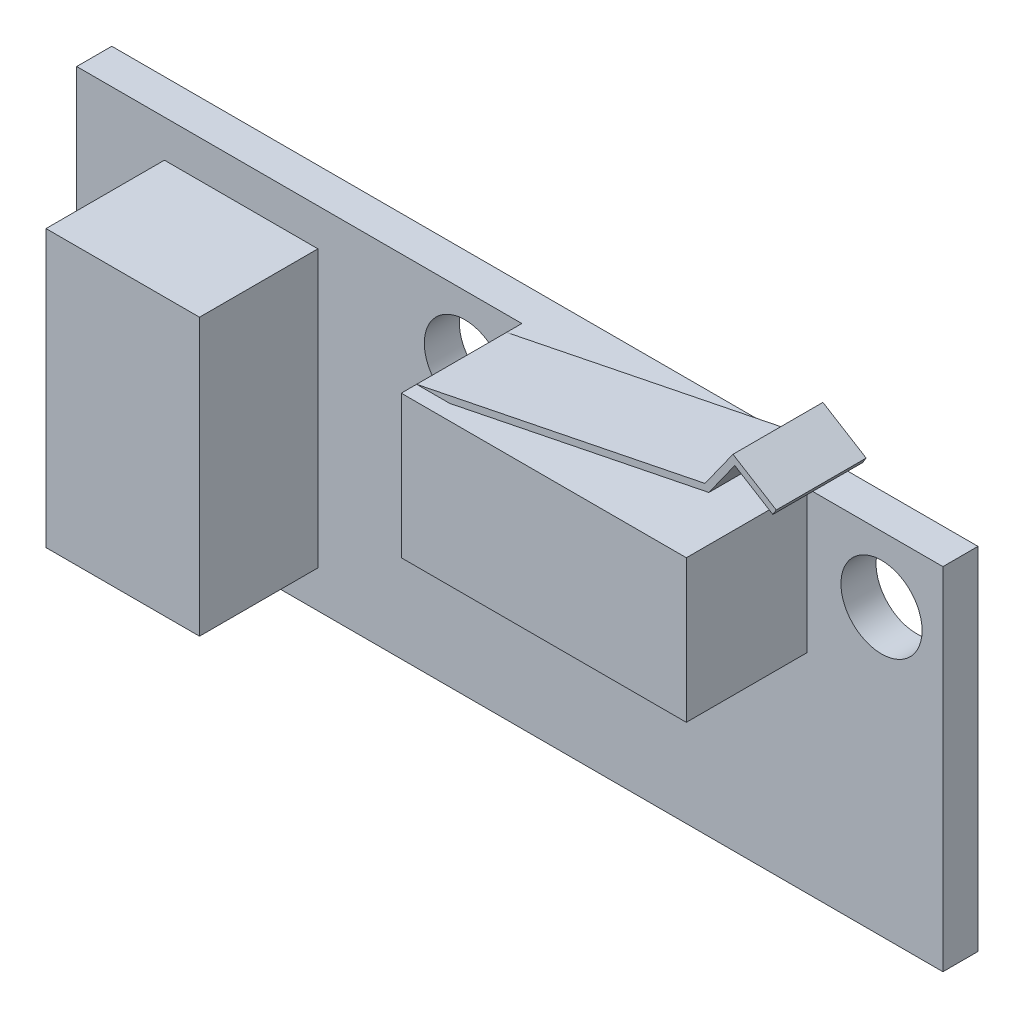
ISO-10303-21;
HEADER;
FILE_DESCRIPTION(('STEP AP214'),'2;1');
FILE_NAME('part.step','',(''),(''),'','','');
FILE_SCHEMA(('AUTOMOTIVE_DESIGN { 1 0 10303 214 1 1 1 1 }'));
ENDSEC;
DATA;
#1=APPLICATION_CONTEXT('core data for automotive mechanical design processes');
#2=APPLICATION_PROTOCOL_DEFINITION('international standard','automotive_design',2000,#1);
#3=PRODUCT_CONTEXT('',#1,'mechanical');
#4=PRODUCT('Part','Part','',(#3));
#5=PRODUCT_RELATED_PRODUCT_CATEGORY('part','',(#4));
#6=PRODUCT_DEFINITION_FORMATION('','',#4);
#7=PRODUCT_DEFINITION_CONTEXT('part definition',#1,'design');
#8=PRODUCT_DEFINITION('design','',#6,#7);
#9=PRODUCT_DEFINITION_SHAPE('','',#8);
#10=(LENGTH_UNIT() NAMED_UNIT(*) SI_UNIT(.MILLI.,.METRE.));
#11=(NAMED_UNIT(*) PLANE_ANGLE_UNIT() SI_UNIT($,.RADIAN.));
#12=(NAMED_UNIT(*) SI_UNIT($,.STERADIAN.) SOLID_ANGLE_UNIT());
#13=UNCERTAINTY_MEASURE_WITH_UNIT(LENGTH_MEASURE(1.E-05),#10,'distance_accuracy_value','');
#14=(GEOMETRIC_REPRESENTATION_CONTEXT(3) GLOBAL_UNCERTAINTY_ASSIGNED_CONTEXT((#13)) GLOBAL_UNIT_ASSIGNED_CONTEXT((#10,
#11,#12)) REPRESENTATION_CONTEXT('',''));
#15=CARTESIAN_POINT('',(0.,0.,0.));
#16=DIRECTION('',(0.,0.,1.));
#17=DIRECTION('',(1.,0.,0.));
#18=AXIS2_PLACEMENT_3D('',#15,#16,#17);
#19=CARTESIAN_POINT('',(0.,0.,1.6));
#20=DIRECTION('',(0.,0.,-1.));
#21=DIRECTION('',(-1.,0.,0.));
#22=AXIS2_PLACEMENT_3D('',#19,#20,#21);
#23=PLANE('',#22);
#24=DIRECTION('',(0.,-1.,0.));
#25=VECTOR('',#24,1.);
#26=CARTESIAN_POINT('',(0.55,8.,1.6));
#27=LINE('',#26,#25);
#28=CARTESIAN_POINT('',(0.55,8.,1.6));
#29=VERTEX_POINT('',#28);
#30=CARTESIAN_POINT('',(0.550000000000001,1.5,1.6));
#31=VERTEX_POINT('',#30);
#32=EDGE_CURVE('E261',#29,#31,#27,.T.);
#33=ORIENTED_EDGE('',*,*,#32,.F.);
#34=DIRECTION('',(-1.,0.,0.));
#35=VECTOR('',#34,1.);
#36=CARTESIAN_POINT('',(-19.75,8.,1.6));
#37=LINE('',#36,#35);
#38=CARTESIAN_POINT('',(-19.75,8.,1.6));
#39=VERTEX_POINT('',#38);
#40=EDGE_CURVE('E307',#29,#39,#37,.T.);
#41=ORIENTED_EDGE('',*,*,#40,.T.);
#42=DIRECTION('',(0.,-1.,0.));
#43=VECTOR('',#42,1.);
#44=CARTESIAN_POINT('',(-19.75,-8.,1.6));
#45=LINE('',#44,#43);
#46=CARTESIAN_POINT('',(-19.75,-8.,1.6));
#47=VERTEX_POINT('',#46);
#48=EDGE_CURVE('E312',#39,#47,#45,.T.);
#49=ORIENTED_EDGE('',*,*,#48,.T.);
#50=DIRECTION('',(1.,0.,0.));
#51=VECTOR('',#50,1.);
#52=CARTESIAN_POINT('',(-19.75,-8.,1.6));
#53=LINE('',#52,#51);
#54=CARTESIAN_POINT('',(19.75,-8.,1.6));
#55=VERTEX_POINT('',#54);
#56=EDGE_CURVE('E314',#47,#55,#53,.T.);
#57=ORIENTED_EDGE('',*,*,#56,.T.);
#58=DIRECTION('',(0.,1.,0.));
#59=VECTOR('',#58,1.);
#60=CARTESIAN_POINT('',(19.75,-8.,1.6));
#61=LINE('',#60,#59);
#62=CARTESIAN_POINT('',(19.75,8.,1.6));
#63=VERTEX_POINT('',#62);
#64=EDGE_CURVE('E304',#55,#63,#61,.T.);
#65=ORIENTED_EDGE('',*,*,#64,.T.);
#66=CARTESIAN_POINT('',(13.55,8.,1.6));
#67=VERTEX_POINT('',#66);
#68=EDGE_CURVE('E309',#63,#67,#37,.T.);
#69=ORIENTED_EDGE('',*,*,#68,.T.);
#70=DIRECTION('',(0.,1.,0.));
#71=VECTOR('',#70,1.);
#72=CARTESIAN_POINT('',(13.55,8.,1.6));
#73=LINE('',#72,#71);
#74=CARTESIAN_POINT('',(13.55,1.5,1.6));
#75=VERTEX_POINT('',#74);
#76=EDGE_CURVE('E266',#75,#67,#73,.T.);
#77=ORIENTED_EDGE('',*,*,#76,.F.);
#78=DIRECTION('',(1.,0.,0.));
#79=VECTOR('',#78,1.);
#80=CARTESIAN_POINT('',(0.550000000000001,1.5,1.6));
#81=LINE('',#80,#79);
#82=EDGE_CURVE('E275',#31,#75,#81,.T.);
#83=ORIENTED_EDGE('',*,*,#82,.F.);
#84=EDGE_LOOP('',(#33,#41,#49,#57,#65,#69,#77,#83));
#85=FACE_BOUND('',#84,.T.);
#86=CARTESIAN_POINT('',(16.95,5.,1.6));
#87=DIRECTION('',(0.,0.,1.));
#88=DIRECTION('',(1.,0.,0.));
#89=AXIS2_PLACEMENT_3D('',#86,#87,#88);
#90=CIRCLE('',#89,1.85);
#91=CARTESIAN_POINT('',(18.8,5.,1.6));
#92=VERTEX_POINT('',#91);
#93=EDGE_CURVE('E296',#92,#92,#90,.T.);
#94=ORIENTED_EDGE('',*,*,#93,.F.);
#95=EDGE_LOOP('',(#94));
#96=FACE_BOUND('',#95,.T.);
#97=CARTESIAN_POINT('',(-2.05,5.,1.6));
#98=DIRECTION('',(0.,0.,1.));
#99=DIRECTION('',(1.,0.,0.));
#100=AXIS2_PLACEMENT_3D('',#97,#98,#99);
#101=CIRCLE('',#100,1.85);
#102=CARTESIAN_POINT('',(-0.2,5.,1.6));
#103=VERTEX_POINT('',#102);
#104=EDGE_CURVE('E291',#103,#103,#101,.T.);
#105=ORIENTED_EDGE('',*,*,#104,.F.);
#106=EDGE_LOOP('',(#105));
#107=FACE_BOUND('',#106,.T.);
#108=DIRECTION('',(0.,1.,0.));
#109=VECTOR('',#108,1.);
#110=CARTESIAN_POINT('',(-8.75,-6.3,1.6));
#111=LINE('',#110,#109);
#112=CARTESIAN_POINT('',(-8.75,-6.3,1.6));
#113=VERTEX_POINT('',#112);
#114=CARTESIAN_POINT('',(-8.75,6.3,1.6));
#115=VERTEX_POINT('',#114);
#116=EDGE_CURVE('E190',#113,#115,#111,.T.);
#117=ORIENTED_EDGE('',*,*,#116,.F.);
#118=DIRECTION('',(1.,0.,0.));
#119=VECTOR('',#118,1.);
#120=CARTESIAN_POINT('',(-15.75,-6.3,1.6));
#121=LINE('',#120,#119);
#122=CARTESIAN_POINT('',(-15.75,-6.3,1.6));
#123=VERTEX_POINT('',#122);
#124=EDGE_CURVE('E187',#123,#113,#121,.T.);
#125=ORIENTED_EDGE('',*,*,#124,.F.);
#126=DIRECTION('',(0.,-1.,0.));
#127=VECTOR('',#126,1.);
#128=CARTESIAN_POINT('',(-15.75,-6.3,1.6));
#129=LINE('',#128,#127);
#130=CARTESIAN_POINT('',(-15.75,6.3,1.6));
#131=VERTEX_POINT('',#130);
#132=EDGE_CURVE('E53',#131,#123,#129,.T.);
#133=ORIENTED_EDGE('',*,*,#132,.F.);
#134=DIRECTION('',(-1.,0.,0.));
#135=VECTOR('',#134,1.);
#136=CARTESIAN_POINT('',(-15.75,6.3,1.6));
#137=LINE('',#136,#135);
#138=EDGE_CURVE('E48',#115,#131,#137,.T.);
#139=ORIENTED_EDGE('',*,*,#138,.F.);
#140=EDGE_LOOP('',(#117,#125,#133,#139));
#141=FACE_BOUND('',#140,.T.);
#142=ADVANCED_FACE('F33',(#85,#96,#107,#141),#23,.F.);
#143=CARTESIAN_POINT('',(13.8759660549111,10.3906288236853,-15.3930132701649));
#144=DIRECTION('',(0.198344544636717,-0.980132359231575,0.));
#145=DIRECTION('',(0.980132359231575,0.198344544636717,0.));
#146=AXIS2_PLACEMENT_3D('',#143,#144,#145);
#147=PLANE('',#146);
#148=DIRECTION('',(0.,0.,1.));
#149=VECTOR('',#148,1.);
#150=CARTESIAN_POINT('',(13.8759660549111,10.3906288236853,-15.3930132701649));
#151=LINE('',#150,#149);
#152=CARTESIAN_POINT('',(13.8759660549111,10.3906288236853,2.3));
#153=VERTEX_POINT('',#152);
#154=CARTESIAN_POINT('',(13.8759660549111,10.3906288236853,6.4));
#155=VERTEX_POINT('',#154);
#156=EDGE_CURVE('E240',#153,#155,#151,.T.);
#157=ORIENTED_EDGE('',*,*,#156,.T.);
#158=DIRECTION('',(-0.980132359231575,-0.198344544636717,0.));
#159=VECTOR('',#158,1.);
#160=CARTESIAN_POINT('',(13.8759660549111,10.3906288236853,6.4));
#161=LINE('',#160,#159);
#162=CARTESIAN_POINT('',(2.06251954294721,8.,6.4));
#163=VERTEX_POINT('',#162);
#164=EDGE_CURVE('E237',#155,#163,#161,.T.);
#165=ORIENTED_EDGE('',*,*,#164,.T.);
#166=DIRECTION('',(0.,0.,1.));
#167=VECTOR('',#166,1.);
#168=CARTESIAN_POINT('',(2.06251954294721,8.,-15.3930132701649));
#169=LINE('',#168,#167);
#170=CARTESIAN_POINT('',(2.06251954294721,8.,2.3));
#171=VERTEX_POINT('',#170);
#172=EDGE_CURVE('E244',#171,#163,#169,.T.);
#173=ORIENTED_EDGE('',*,*,#172,.F.);
#174=DIRECTION('',(0.980132359231575,0.198344544636717,0.));
#175=VECTOR('',#174,1.);
#176=CARTESIAN_POINT('',(13.8759660549111,10.3906288236853,2.3));
#177=LINE('',#176,#175);
#178=EDGE_CURVE('E219',#171,#153,#177,.T.);
#179=ORIENTED_EDGE('',*,*,#178,.T.);
#180=EDGE_LOOP('',(#157,#165,#173,#179));
#181=FACE_BOUND('',#180,.T.);
#182=ADVANCED_FACE('F371',(#181),#147,.T.);
#183=CARTESIAN_POINT('',(15.0587785145612,12.0476863131206,-15.3930132701649));
#184=DIRECTION('',(0.813919290439679,-0.580977958833354,0.));
#185=DIRECTION('',(0.580977958833354,0.813919290439679,0.));
#186=AXIS2_PLACEMENT_3D('',#183,#184,#185);
#187=PLANE('',#186);
#188=DIRECTION('',(0.,0.,1.));
#189=VECTOR('',#188,1.);
#190=CARTESIAN_POINT('',(15.0587785145612,12.0476863131206,-15.3930132701649));
#191=LINE('',#190,#189);
#192=CARTESIAN_POINT('',(15.0587785145612,12.0476863131206,2.3));
#193=VERTEX_POINT('',#192);
#194=CARTESIAN_POINT('',(15.0587785145612,12.0476863131206,6.4));
#195=VERTEX_POINT('',#194);
#196=EDGE_CURVE('E254',#193,#195,#191,.T.);
#197=ORIENTED_EDGE('',*,*,#196,.T.);
#198=DIRECTION('',(-0.580977958833354,-0.813919290439679,0.));
#199=VECTOR('',#198,1.);
#200=CARTESIAN_POINT('',(15.0587785145612,12.0476863131206,6.4));
#201=LINE('',#200,#199);
#202=EDGE_CURVE('E234',#195,#155,#201,.T.);
#203=ORIENTED_EDGE('',*,*,#202,.T.);
#204=ORIENTED_EDGE('',*,*,#156,.F.);
#205=DIRECTION('',(0.580977958833354,0.813919290439679,0.));
#206=VECTOR('',#205,1.);
#207=CARTESIAN_POINT('',(15.0587785145612,12.0476863131206,2.3));
#208=LINE('',#207,#206);
#209=EDGE_CURVE('E216',#153,#193,#208,.T.);
#210=ORIENTED_EDGE('',*,*,#209,.T.);
#211=EDGE_LOOP('',(#197,#203,#204,#210));
#212=FACE_BOUND('',#211,.T.);
#213=ADVANCED_FACE('F368',(#212),#187,.T.);
#214=CARTESIAN_POINT('',(16.7928028673529,10.980894683081,-15.3930132701649));
#215=DIRECTION('',(-0.523990442157015,-0.851724143445573,0.));
#216=DIRECTION('',(0.851724143445573,-0.523990442157016,0.));
#217=AXIS2_PLACEMENT_3D('',#214,#215,#216);
#218=PLANE('',#217);
#219=DIRECTION('',(0.,0.,1.));
#220=VECTOR('',#219,1.);
#221=CARTESIAN_POINT('',(16.7928028673529,10.980894683081,-15.3930132701649));
#222=LINE('',#221,#220);
#223=CARTESIAN_POINT('',(16.7928028673529,10.980894683081,2.3));
#224=VERTEX_POINT('',#223);
#225=CARTESIAN_POINT('',(16.7928028673529,10.980894683081,6.4));
#226=VERTEX_POINT('',#225);
#227=EDGE_CURVE('E251',#224,#226,#222,.T.);
#228=ORIENTED_EDGE('',*,*,#227,.T.);
#229=DIRECTION('',(-0.851724143445573,0.523990442157016,0.));
#230=VECTOR('',#229,1.);
#231=CARTESIAN_POINT('',(16.7928028673529,10.980894683081,6.4));
#232=LINE('',#231,#230);
#233=EDGE_CURVE('E231',#226,#195,#232,.T.);
#234=ORIENTED_EDGE('',*,*,#233,.T.);
#235=ORIENTED_EDGE('',*,*,#196,.F.);
#236=DIRECTION('',(0.851724143445573,-0.523990442157016,0.));
#237=VECTOR('',#236,1.);
#238=CARTESIAN_POINT('',(16.7928028673529,10.980894683081,2.3));
#239=LINE('',#238,#237);
#240=EDGE_CURVE('E213',#193,#224,#239,.T.);
#241=ORIENTED_EDGE('',*,*,#240,.T.);
#242=EDGE_LOOP('',(#228,#234,#235,#241));
#243=FACE_BOUND('',#242,.T.);
#244=ADVANCED_FACE('F366',(#243),#218,.T.);
#245=CARTESIAN_POINT('',(16.95,11.2364119261147,-15.3930132701649));
#246=DIRECTION('',(0.851724143445577,-0.523990442157009,0.));
#247=DIRECTION('',(0.523990442157009,0.851724143445577,0.));
#248=AXIS2_PLACEMENT_3D('',#245,#246,#247);
#249=PLANE('',#248);
#250=DIRECTION('',(0.,0.,1.));
#251=VECTOR('',#250,1.);
#252=CARTESIAN_POINT('',(16.95,11.2364119261147,-15.3930132701649));
#253=LINE('',#252,#251);
#254=CARTESIAN_POINT('',(16.95,11.2364119261147,2.3));
#255=VERTEX_POINT('',#254);
#256=CARTESIAN_POINT('',(16.95,11.2364119261147,6.4));
#257=VERTEX_POINT('',#256);
#258=EDGE_CURVE('E248',#255,#257,#253,.T.);
#259=ORIENTED_EDGE('',*,*,#258,.T.);
#260=DIRECTION('',(-0.523990442157009,-0.851724143445577,0.));
#261=VECTOR('',#260,1.);
#262=CARTESIAN_POINT('',(16.95,11.2364119261147,6.4));
#263=LINE('',#262,#261);
#264=EDGE_CURVE('E228',#257,#226,#263,.T.);
#265=ORIENTED_EDGE('',*,*,#264,.T.);
#266=ORIENTED_EDGE('',*,*,#227,.F.);
#267=DIRECTION('',(0.523990442157009,0.851724143445577,0.));
#268=VECTOR('',#267,1.);
#269=CARTESIAN_POINT('',(16.95,11.2364119261147,2.3));
#270=LINE('',#269,#268);
#271=EDGE_CURVE('E210',#224,#255,#270,.T.);
#272=ORIENTED_EDGE('',*,*,#271,.T.);
#273=EDGE_LOOP('',(#259,#265,#266,#272));
#274=FACE_BOUND('',#273,.T.);
#275=ADVANCED_FACE('F362',(#274),#249,.T.);
#276=CARTESIAN_POINT('',(14.9773642807859,12.45,-15.3930132701649));
#277=DIRECTION('',(0.523990442157015,0.851724143445573,0.));
#278=DIRECTION('',(-0.851724143445574,0.523990442157015,0.));
#279=AXIS2_PLACEMENT_3D('',#276,#277,#278);
#280=PLANE('',#279);
#281=DIRECTION('',(0.,0.,1.));
#282=VECTOR('',#281,1.);
#283=CARTESIAN_POINT('',(14.9773642807859,12.45,-15.3930132701649));
#284=LINE('',#283,#282);
#285=CARTESIAN_POINT('',(14.9773642807859,12.45,2.3));
#286=VERTEX_POINT('',#285);
#287=CARTESIAN_POINT('',(14.9773642807859,12.45,6.4));
#288=VERTEX_POINT('',#287);
#289=EDGE_CURVE('E245',#286,#288,#284,.T.);
#290=ORIENTED_EDGE('',*,*,#289,.T.);
#291=DIRECTION('',(0.851724143445574,-0.523990442157015,0.));
#292=VECTOR('',#291,1.);
#293=CARTESIAN_POINT('',(14.9773642807859,12.45,6.4));
#294=LINE('',#293,#292);
#295=EDGE_CURVE('E225',#288,#257,#294,.T.);
#296=ORIENTED_EDGE('',*,*,#295,.T.);
#297=ORIENTED_EDGE('',*,*,#258,.F.);
#298=DIRECTION('',(-0.851724143445574,0.523990442157015,0.));
#299=VECTOR('',#298,1.);
#300=CARTESIAN_POINT('',(14.9773642807859,12.45,2.3));
#301=LINE('',#300,#299);
#302=EDGE_CURVE('E207',#255,#286,#301,.T.);
#303=ORIENTED_EDGE('',*,*,#302,.T.);
#304=EDGE_LOOP('',(#290,#296,#297,#303));
#305=FACE_BOUND('',#304,.T.);
#306=ADVANCED_FACE('F360',(#305),#280,.T.);
#307=CARTESIAN_POINT('',(13.7005173824207,10.6612052519095,-15.3930132701649));
#308=DIRECTION('',(-0.813919290439679,0.580977958833353,0.));
#309=DIRECTION('',(-0.580977958833353,-0.813919290439679,0.));
#310=AXIS2_PLACEMENT_3D('',#307,#308,#309);
#311=PLANE('',#310);
#312=DIRECTION('',(0.,0.,1.));
#313=VECTOR('',#312,1.);
#314=CARTESIAN_POINT('',(13.7005173824207,10.6612052519095,-15.3930132701649));
#315=LINE('',#314,#313);
#316=CARTESIAN_POINT('',(13.7005173824207,10.6612052519095,2.3));
#317=VERTEX_POINT('',#316);
#318=CARTESIAN_POINT('',(13.7005173824207,10.6612052519095,6.4));
#319=VERTEX_POINT('',#318);
#320=EDGE_CURVE('E241',#317,#319,#315,.T.);
#321=ORIENTED_EDGE('',*,*,#320,.T.);
#322=DIRECTION('',(0.580977958833353,0.813919290439679,0.));
#323=VECTOR('',#322,1.);
#324=CARTESIAN_POINT('',(13.7005173824207,10.6612052519095,6.4));
#325=LINE('',#324,#323);
#326=EDGE_CURVE('E222',#319,#288,#325,.T.);
#327=ORIENTED_EDGE('',*,*,#326,.T.);
#328=ORIENTED_EDGE('',*,*,#289,.F.);
#329=DIRECTION('',(-0.580977958833353,-0.813919290439679,0.));
#330=VECTOR('',#329,1.);
#331=CARTESIAN_POINT('',(13.7005173824207,10.6612052519095,2.3));
#332=LINE('',#331,#330);
#333=EDGE_CURVE('E201',#286,#317,#332,.T.);
#334=ORIENTED_EDGE('',*,*,#333,.T.);
#335=EDGE_LOOP('',(#321,#327,#328,#334));
#336=FACE_BOUND('',#335,.T.);
#337=ADVANCED_FACE('F355',(#336),#311,.T.);
#338=CARTESIAN_POINT('',(0.55,8.,-15.3930132701649));
#339=DIRECTION('',(-0.198344544636717,0.980132359231575,0.));
#340=DIRECTION('',(-0.980132359231575,-0.198344544636717,0.));
#341=AXIS2_PLACEMENT_3D('',#338,#339,#340);
#342=PLANE('',#341);
#343=DIRECTION('',(0.,0.,-1.));
#344=VECTOR('',#343,1.);
#345=CARTESIAN_POINT('',(0.55,8.,7.1));
#346=LINE('',#345,#344);
#347=CARTESIAN_POINT('',(0.55,8.,6.4));
#348=VERTEX_POINT('',#347);
#349=CARTESIAN_POINT('',(0.55,8.,2.3));
#350=VERTEX_POINT('',#349);
#351=EDGE_CURVE('E272',#348,#350,#346,.T.);
#352=ORIENTED_EDGE('',*,*,#351,.F.);
#353=DIRECTION('',(0.980132359231575,0.198344544636717,0.));
#354=VECTOR('',#353,1.);
#355=CARTESIAN_POINT('',(0.55,8.,6.4));
#356=LINE('',#355,#354);
#357=EDGE_CURVE('E11',#348,#319,#356,.T.);
#358=ORIENTED_EDGE('',*,*,#357,.T.);
#359=ORIENTED_EDGE('',*,*,#320,.F.);
#360=DIRECTION('',(-0.980132359231575,-0.198344544636717,0.));
#361=VECTOR('',#360,1.);
#362=CARTESIAN_POINT('',(0.55,8.,2.3));
#363=LINE('',#362,#361);
#364=EDGE_CURVE('E41',#317,#350,#363,.T.);
#365=ORIENTED_EDGE('',*,*,#364,.T.);
#366=EDGE_LOOP('',(#352,#358,#359,#365));
#367=FACE_BOUND('',#366,.T.);
#368=ADVANCED_FACE('F339',(#367),#342,.T.);
#369=CARTESIAN_POINT('',(19.75,-8.,1.6));
#370=DIRECTION('',(-1.,0.,0.));
#371=DIRECTION('',(0.,0.,1.));
#372=AXIS2_PLACEMENT_3D('',#369,#370,#371);
#373=PLANE('',#372);
#374=DIRECTION('',(0.,1.,0.));
#375=VECTOR('',#374,1.);
#376=CARTESIAN_POINT('',(19.75,-8.,0.));
#377=LINE('',#376,#375);
#378=CARTESIAN_POINT('',(19.75,-8.,0.));
#379=VERTEX_POINT('',#378);
#380=CARTESIAN_POINT('',(19.75,8.,0.));
#381=VERTEX_POINT('',#380);
#382=EDGE_CURVE('E295',#379,#381,#377,.T.);
#383=ORIENTED_EDGE('',*,*,#382,.T.);
#384=DIRECTION('',(0.,0.,-1.));
#385=VECTOR('',#384,1.);
#386=CARTESIAN_POINT('',(19.75,8.,1.6));
#387=LINE('',#386,#385);
#388=EDGE_CURVE('E332',#63,#381,#387,.T.);
#389=ORIENTED_EDGE('',*,*,#388,.F.);
#390=ORIENTED_EDGE('',*,*,#64,.F.);
#391=DIRECTION('',(0.,0.,-1.));
#392=VECTOR('',#391,1.);
#393=CARTESIAN_POINT('',(19.75,-8.,1.6));
#394=LINE('',#393,#392);
#395=EDGE_CURVE('E316',#55,#379,#394,.T.);
#396=ORIENTED_EDGE('',*,*,#395,.T.);
#397=EDGE_LOOP('',(#383,#389,#390,#396));
#398=FACE_BOUND('',#397,.T.);
#399=ADVANCED_FACE('F35',(#398),#373,.F.);
#400=CARTESIAN_POINT('',(-19.75,8.,1.6));
#401=DIRECTION('',(0.,-1.,0.));
#402=DIRECTION('',(0.,0.,-1.));
#403=AXIS2_PLACEMENT_3D('',#400,#401,#402);
#404=PLANE('',#403);
#405=DIRECTION('',(0.,0.,-1.));
#406=VECTOR('',#405,1.);
#407=CARTESIAN_POINT('',(13.55,8.,7.1));
#408=LINE('',#407,#406);
#409=CARTESIAN_POINT('',(13.55,8.,7.1));
#410=VERTEX_POINT('',#409);
#411=EDGE_CURVE('E283',#410,#67,#408,.T.);
#412=ORIENTED_EDGE('',*,*,#411,.T.);
#413=ORIENTED_EDGE('',*,*,#68,.F.);
#414=ORIENTED_EDGE('',*,*,#388,.T.);
#415=DIRECTION('',(-1.,0.,0.));
#416=VECTOR('',#415,1.);
#417=CARTESIAN_POINT('',(-19.75,8.,0.));
#418=LINE('',#417,#416);
#419=CARTESIAN_POINT('',(-19.75,8.,0.));
#420=VERTEX_POINT('',#419);
#421=EDGE_CURVE('E319',#381,#420,#418,.T.);
#422=ORIENTED_EDGE('',*,*,#421,.T.);
#423=DIRECTION('',(0.,0.,-1.));
#424=VECTOR('',#423,1.);
#425=CARTESIAN_POINT('',(-19.75,8.,1.6));
#426=LINE('',#425,#424);
#427=EDGE_CURVE('E329',#39,#420,#426,.T.);
#428=ORIENTED_EDGE('',*,*,#427,.F.);
#429=ORIENTED_EDGE('',*,*,#40,.F.);
#430=DIRECTION('',(0.,0.,1.));
#431=VECTOR('',#430,1.);
#432=CARTESIAN_POINT('',(0.55,8.,1.6));
#433=LINE('',#432,#431);
#434=EDGE_CURVE('E191',#29,#350,#433,.T.);
#435=ORIENTED_EDGE('',*,*,#434,.T.);
#436=DIRECTION('',(1.,0.,0.));
#437=VECTOR('',#436,1.);
#438=CARTESIAN_POINT('',(0.55,8.,2.3));
#439=LINE('',#438,#437);
#440=EDGE_CURVE('E194',#350,#171,#439,.T.);
#441=ORIENTED_EDGE('',*,*,#440,.T.);
#442=ORIENTED_EDGE('',*,*,#172,.T.);
#443=DIRECTION('',(-1.,0.,0.));
#444=VECTOR('',#443,1.);
#445=CARTESIAN_POINT('',(0.55,8.,6.4));
#446=LINE('',#445,#444);
#447=EDGE_CURVE('E200',#163,#348,#446,.T.);
#448=ORIENTED_EDGE('',*,*,#447,.T.);
#449=CARTESIAN_POINT('',(0.55,8.,7.1));
#450=VERTEX_POINT('',#449);
#451=EDGE_CURVE('E280',#450,#348,#346,.T.);
#452=ORIENTED_EDGE('',*,*,#451,.F.);
#453=DIRECTION('',(-1.,0.,0.));
#454=VECTOR('',#453,1.);
#455=CARTESIAN_POINT('',(0.55,8.,7.1));
#456=LINE('',#455,#454);
#457=EDGE_CURVE('E270',#410,#450,#456,.T.);
#458=ORIENTED_EDGE('',*,*,#457,.F.);
#459=EDGE_LOOP('',(#412,#413,#414,#422,#428,#429,#435,#441,#442,#448,#452,#458));
#460=FACE_BOUND('',#459,.T.);
#461=ADVANCED_FACE('F349',(#460),#404,.F.);
#462=CARTESIAN_POINT('',(-19.75,-8.,1.6));
#463=DIRECTION('',(1.,0.,0.));
#464=DIRECTION('',(0.,0.,-1.));
#465=AXIS2_PLACEMENT_3D('',#462,#463,#464);
#466=PLANE('',#465);
#467=DIRECTION('',(0.,-1.,0.));
#468=VECTOR('',#467,1.);
#469=CARTESIAN_POINT('',(-19.75,-8.,0.));
#470=LINE('',#469,#468);
#471=CARTESIAN_POINT('',(-19.75,-8.,0.));
#472=VERTEX_POINT('',#471);
#473=EDGE_CURVE('E321',#420,#472,#470,.T.);
#474=ORIENTED_EDGE('',*,*,#473,.T.);
#475=DIRECTION('',(0.,0.,-1.));
#476=VECTOR('',#475,1.);
#477=CARTESIAN_POINT('',(-19.75,-8.,1.6));
#478=LINE('',#477,#476);
#479=EDGE_CURVE('E326',#47,#472,#478,.T.);
#480=ORIENTED_EDGE('',*,*,#479,.F.);
#481=ORIENTED_EDGE('',*,*,#48,.F.);
#482=ORIENTED_EDGE('',*,*,#427,.T.);
#483=EDGE_LOOP('',(#474,#480,#481,#482));
#484=FACE_BOUND('',#483,.T.);
#485=ADVANCED_FACE('F413',(#484),#466,.F.);
#486=CARTESIAN_POINT('',(-19.75,-8.,1.6));
#487=DIRECTION('',(0.,1.,0.));
#488=DIRECTION('',(0.,0.,1.));
#489=AXIS2_PLACEMENT_3D('',#486,#487,#488);
#490=PLANE('',#489);
#491=DIRECTION('',(1.,0.,0.));
#492=VECTOR('',#491,1.);
#493=CARTESIAN_POINT('',(-19.75,-8.,0.));
#494=LINE('',#493,#492);
#495=EDGE_CURVE('E308',#472,#379,#494,.T.);
#496=ORIENTED_EDGE('',*,*,#495,.T.);
#497=ORIENTED_EDGE('',*,*,#395,.F.);
#498=ORIENTED_EDGE('',*,*,#56,.F.);
#499=ORIENTED_EDGE('',*,*,#479,.T.);
#500=EDGE_LOOP('',(#496,#497,#498,#499));
#501=FACE_BOUND('',#500,.T.);
#502=ADVANCED_FACE('F409',(#501),#490,.F.);
#503=CARTESIAN_POINT('',(0.,0.,0.));
#504=DIRECTION('',(0.,0.,-1.));
#505=DIRECTION('',(-1.,0.,0.));
#506=AXIS2_PLACEMENT_3D('',#503,#504,#505);
#507=PLANE('',#506);
#508=CARTESIAN_POINT('',(16.95,5.,0.));
#509=DIRECTION('',(0.,0.,1.));
#510=DIRECTION('',(1.,0.,0.));
#511=AXIS2_PLACEMENT_3D('',#508,#509,#510);
#512=CIRCLE('',#511,1.85);
#513=CARTESIAN_POINT('',(18.8,5.,0.));
#514=VERTEX_POINT('',#513);
#515=EDGE_CURVE('E292',#514,#514,#512,.T.);
#516=ORIENTED_EDGE('',*,*,#515,.T.);
#517=EDGE_LOOP('',(#516));
#518=FACE_BOUND('',#517,.T.);
#519=CARTESIAN_POINT('',(-2.05,5.,0.));
#520=DIRECTION('',(0.,0.,1.));
#521=DIRECTION('',(1.,0.,0.));
#522=AXIS2_PLACEMENT_3D('',#519,#520,#521);
#523=CIRCLE('',#522,1.85);
#524=CARTESIAN_POINT('',(-0.2,5.,0.));
#525=VERTEX_POINT('',#524);
#526=EDGE_CURVE('E299',#525,#525,#523,.T.);
#527=ORIENTED_EDGE('',*,*,#526,.T.);
#528=EDGE_LOOP('',(#527));
#529=FACE_BOUND('',#528,.T.);
#530=ORIENTED_EDGE('',*,*,#382,.F.);
#531=ORIENTED_EDGE('',*,*,#495,.F.);
#532=ORIENTED_EDGE('',*,*,#473,.F.);
#533=ORIENTED_EDGE('',*,*,#421,.F.);
#534=EDGE_LOOP('',(#530,#531,#532,#533));
#535=FACE_BOUND('',#534,.T.);
#536=ADVANCED_FACE('F404',(#518,#529,#535),#507,.T.);
#537=CARTESIAN_POINT('',(-2.05,5.,0.));
#538=DIRECTION('',(0.,0.,1.));
#539=DIRECTION('',(1.,0.,0.));
#540=AXIS2_PLACEMENT_3D('',#537,#538,#539);
#541=CYLINDRICAL_SURFACE('',#540,1.85);
#542=ORIENTED_EDGE('',*,*,#526,.F.);
#543=EDGE_LOOP('',(#542));
#544=FACE_BOUND('',#543,.T.);
#545=ORIENTED_EDGE('',*,*,#104,.T.);
#546=EDGE_LOOP('',(#545));
#547=FACE_BOUND('',#546,.T.);
#548=ADVANCED_FACE('F401',(#544,#547),#541,.F.);
#549=CARTESIAN_POINT('',(16.95,5.,0.));
#550=DIRECTION('',(0.,0.,1.));
#551=DIRECTION('',(1.,0.,0.));
#552=AXIS2_PLACEMENT_3D('',#549,#550,#551);
#553=CYLINDRICAL_SURFACE('',#552,1.85);
#554=ORIENTED_EDGE('',*,*,#515,.F.);
#555=EDGE_LOOP('',(#554));
#556=FACE_BOUND('',#555,.T.);
#557=ORIENTED_EDGE('',*,*,#93,.T.);
#558=EDGE_LOOP('',(#557));
#559=FACE_BOUND('',#558,.T.);
#560=ADVANCED_FACE('F398',(#556,#559),#553,.F.);
#561=CARTESIAN_POINT('',(0.55,8.,7.1));
#562=DIRECTION('',(1.,0.,0.));
#563=DIRECTION('',(0.,1.,0.));
#564=AXIS2_PLACEMENT_3D('',#561,#562,#563);
#565=PLANE('',#564);
#566=ORIENTED_EDGE('',*,*,#32,.T.);
#567=DIRECTION('',(0.,0.,-1.));
#568=VECTOR('',#567,1.);
#569=CARTESIAN_POINT('',(0.550000000000001,1.5,7.1));
#570=LINE('',#569,#568);
#571=CARTESIAN_POINT('',(0.550000000000001,1.5,7.1));
#572=VERTEX_POINT('',#571);
#573=EDGE_CURVE('E288',#572,#31,#570,.T.);
#574=ORIENTED_EDGE('',*,*,#573,.F.);
#575=DIRECTION('',(0.,-1.,0.));
#576=VECTOR('',#575,1.);
#577=CARTESIAN_POINT('',(0.55,8.,7.1));
#578=LINE('',#577,#576);
#579=EDGE_CURVE('E262',#450,#572,#578,.T.);
#580=ORIENTED_EDGE('',*,*,#579,.F.);
#581=ORIENTED_EDGE('',*,*,#451,.T.);
#582=ORIENTED_EDGE('',*,*,#351,.T.);
#583=ORIENTED_EDGE('',*,*,#434,.F.);
#584=EDGE_LOOP('',(#566,#574,#580,#581,#582,#583));
#585=FACE_BOUND('',#584,.T.);
#586=ADVANCED_FACE('F342',(#585),#565,.F.);
#587=CARTESIAN_POINT('',(0.550000000000001,1.5,7.1));
#588=DIRECTION('',(0.,1.,0.));
#589=DIRECTION('',(-1.,0.,0.));
#590=AXIS2_PLACEMENT_3D('',#587,#588,#589);
#591=PLANE('',#590);
#592=ORIENTED_EDGE('',*,*,#82,.T.);
#593=DIRECTION('',(0.,0.,-1.));
#594=VECTOR('',#593,1.);
#595=CARTESIAN_POINT('',(13.55,1.5,7.1));
#596=LINE('',#595,#594);
#597=CARTESIAN_POINT('',(13.55,1.5,7.1));
#598=VERTEX_POINT('',#597);
#599=EDGE_CURVE('E285',#598,#75,#596,.T.);
#600=ORIENTED_EDGE('',*,*,#599,.F.);
#601=DIRECTION('',(1.,0.,0.));
#602=VECTOR('',#601,1.);
#603=CARTESIAN_POINT('',(0.550000000000001,1.5,7.1));
#604=LINE('',#603,#602);
#605=EDGE_CURVE('E265',#572,#598,#604,.T.);
#606=ORIENTED_EDGE('',*,*,#605,.F.);
#607=ORIENTED_EDGE('',*,*,#573,.T.);
#608=EDGE_LOOP('',(#592,#600,#606,#607));
#609=FACE_BOUND('',#608,.T.);
#610=ADVANCED_FACE('F391',(#609),#591,.F.);
#611=CARTESIAN_POINT('',(13.55,8.,7.1));
#612=DIRECTION('',(-1.,0.,0.));
#613=DIRECTION('',(0.,0.,1.));
#614=AXIS2_PLACEMENT_3D('',#611,#612,#613);
#615=PLANE('',#614);
#616=ORIENTED_EDGE('',*,*,#76,.T.);
#617=ORIENTED_EDGE('',*,*,#411,.F.);
#618=DIRECTION('',(0.,1.,0.));
#619=VECTOR('',#618,1.);
#620=CARTESIAN_POINT('',(13.55,8.,7.1));
#621=LINE('',#620,#619);
#622=EDGE_CURVE('E268',#598,#410,#621,.T.);
#623=ORIENTED_EDGE('',*,*,#622,.F.);
#624=ORIENTED_EDGE('',*,*,#599,.T.);
#625=EDGE_LOOP('',(#616,#617,#623,#624));
#626=FACE_BOUND('',#625,.T.);
#627=ADVANCED_FACE('F387',(#626),#615,.F.);
#628=CARTESIAN_POINT('',(0.,0.,7.1));
#629=DIRECTION('',(0.,0.,1.));
#630=DIRECTION('',(1.,0.,0.));
#631=AXIS2_PLACEMENT_3D('',#628,#629,#630);
#632=PLANE('',#631);
#633=ORIENTED_EDGE('',*,*,#457,.T.);
#634=ORIENTED_EDGE('',*,*,#579,.T.);
#635=ORIENTED_EDGE('',*,*,#605,.T.);
#636=ORIENTED_EDGE('',*,*,#622,.T.);
#637=EDGE_LOOP('',(#633,#634,#635,#636));
#638=FACE_BOUND('',#637,.T.);
#639=ADVANCED_FACE('F384',(#638),#632,.T.);
#640=CARTESIAN_POINT('',(0.55,22.5,2.3));
#641=DIRECTION('',(0.,0.,-1.));
#642=DIRECTION('',(-1.,0.,0.));
#643=AXIS2_PLACEMENT_3D('',#640,#641,#642);
#644=PLANE('',#643);
#645=ORIENTED_EDGE('',*,*,#440,.F.);
#646=ORIENTED_EDGE('',*,*,#364,.F.);
#647=ORIENTED_EDGE('',*,*,#333,.F.);
#648=ORIENTED_EDGE('',*,*,#302,.F.);
#649=ORIENTED_EDGE('',*,*,#271,.F.);
#650=ORIENTED_EDGE('',*,*,#240,.F.);
#651=ORIENTED_EDGE('',*,*,#209,.F.);
#652=ORIENTED_EDGE('',*,*,#178,.F.);
#653=EDGE_LOOP('',(#645,#646,#647,#648,#649,#650,#651,#652));
#654=FACE_BOUND('',#653,.T.);
#655=ADVANCED_FACE('F357',(#654),#644,.T.);
#656=CARTESIAN_POINT('',(0.55,22.5,6.4));
#657=DIRECTION('',(0.,0.,1.));
#658=DIRECTION('',(1.,0.,0.));
#659=AXIS2_PLACEMENT_3D('',#656,#657,#658);
#660=PLANE('',#659);
#661=ORIENTED_EDGE('',*,*,#202,.F.);
#662=ORIENTED_EDGE('',*,*,#233,.F.);
#663=ORIENTED_EDGE('',*,*,#264,.F.);
#664=ORIENTED_EDGE('',*,*,#295,.F.);
#665=ORIENTED_EDGE('',*,*,#326,.F.);
#666=ORIENTED_EDGE('',*,*,#357,.F.);
#667=ORIENTED_EDGE('',*,*,#447,.F.);
#668=ORIENTED_EDGE('',*,*,#164,.F.);
#669=EDGE_LOOP('',(#661,#662,#663,#664,#665,#666,#667,#668));
#670=FACE_BOUND('',#669,.T.);
#671=ADVANCED_FACE('F353',(#670),#660,.T.);
#672=CARTESIAN_POINT('',(-8.75,-6.3,7.));
#673=DIRECTION('',(-1.,0.,0.));
#674=DIRECTION('',(0.,0.,1.));
#675=AXIS2_PLACEMENT_3D('',#672,#673,#674);
#676=PLANE('',#675);
#677=ORIENTED_EDGE('',*,*,#116,.T.);
#678=DIRECTION('',(0.,0.,-1.));
#679=VECTOR('',#678,1.);
#680=CARTESIAN_POINT('',(-8.75,6.3,7.));
#681=LINE('',#680,#679);
#682=CARTESIAN_POINT('',(-8.75,6.3,7.));
#683=VERTEX_POINT('',#682);
#684=EDGE_CURVE('E171',#683,#115,#681,.T.);
#685=ORIENTED_EDGE('',*,*,#684,.F.);
#686=DIRECTION('',(0.,1.,0.));
#687=VECTOR('',#686,1.);
#688=CARTESIAN_POINT('',(-8.75,-6.3,7.));
#689=LINE('',#688,#687);
#690=CARTESIAN_POINT('',(-8.75,-6.3,7.));
#691=VERTEX_POINT('',#690);
#692=EDGE_CURVE('E178',#691,#683,#689,.T.);
#693=ORIENTED_EDGE('',*,*,#692,.F.);
#694=DIRECTION('',(0.,0.,-1.));
#695=VECTOR('',#694,1.);
#696=CARTESIAN_POINT('',(-8.75,-6.3,7.));
#697=LINE('',#696,#695);
#698=EDGE_CURVE('E450',#691,#113,#697,.T.);
#699=ORIENTED_EDGE('',*,*,#698,.T.);
#700=EDGE_LOOP('',(#677,#685,#693,#699));
#701=FACE_BOUND('',#700,.T.);
#702=ADVANCED_FACE('F189',(#701),#676,.F.);
#703=CARTESIAN_POINT('',(-15.75,6.3,7.));
#704=DIRECTION('',(0.,-1.,0.));
#705=DIRECTION('',(0.,0.,-1.));
#706=AXIS2_PLACEMENT_3D('',#703,#704,#705);
#707=PLANE('',#706);
#708=ORIENTED_EDGE('',*,*,#138,.T.);
#709=DIRECTION('',(0.,0.,-1.));
#710=VECTOR('',#709,1.);
#711=CARTESIAN_POINT('',(-15.75,6.3,7.));
#712=LINE('',#711,#710);
#713=CARTESIAN_POINT('',(-15.75,6.3,7.));
#714=VERTEX_POINT('',#713);
#715=EDGE_CURVE('E174',#714,#131,#712,.T.);
#716=ORIENTED_EDGE('',*,*,#715,.F.);
#717=DIRECTION('',(-1.,0.,0.));
#718=VECTOR('',#717,1.);
#719=CARTESIAN_POINT('',(-15.75,6.3,7.));
#720=LINE('',#719,#718);
#721=EDGE_CURVE('E167',#683,#714,#720,.T.);
#722=ORIENTED_EDGE('',*,*,#721,.F.);
#723=ORIENTED_EDGE('',*,*,#684,.T.);
#724=EDGE_LOOP('',(#708,#716,#722,#723));
#725=FACE_BOUND('',#724,.T.);
#726=ADVANCED_FACE('F169',(#725),#707,.F.);
#727=CARTESIAN_POINT('',(-15.75,-6.3,7.));
#728=DIRECTION('',(1.,0.,0.));
#729=DIRECTION('',(0.,0.,-1.));
#730=AXIS2_PLACEMENT_3D('',#727,#728,#729);
#731=PLANE('',#730);
#732=ORIENTED_EDGE('',*,*,#132,.T.);
#733=DIRECTION('',(0.,0.,-1.));
#734=VECTOR('',#733,1.);
#735=CARTESIAN_POINT('',(-15.75,-6.3,7.));
#736=LINE('',#735,#734);
#737=CARTESIAN_POINT('',(-15.75,-6.3,7.));
#738=VERTEX_POINT('',#737);
#739=EDGE_CURVE('E196',#738,#123,#736,.T.);
#740=ORIENTED_EDGE('',*,*,#739,.F.);
#741=DIRECTION('',(0.,-1.,0.));
#742=VECTOR('',#741,1.);
#743=CARTESIAN_POINT('',(-15.75,-6.3,7.));
#744=LINE('',#743,#742);
#745=EDGE_CURVE('E177',#714,#738,#744,.T.);
#746=ORIENTED_EDGE('',*,*,#745,.F.);
#747=ORIENTED_EDGE('',*,*,#715,.T.);
#748=EDGE_LOOP('',(#732,#740,#746,#747));
#749=FACE_BOUND('',#748,.T.);
#750=ADVANCED_FACE('F459',(#749),#731,.F.);
#751=CARTESIAN_POINT('',(-15.75,-6.3,7.));
#752=DIRECTION('',(0.,1.,0.));
#753=DIRECTION('',(0.,0.,1.));
#754=AXIS2_PLACEMENT_3D('',#751,#752,#753);
#755=PLANE('',#754);
#756=ORIENTED_EDGE('',*,*,#124,.T.);
#757=ORIENTED_EDGE('',*,*,#698,.F.);
#758=DIRECTION('',(1.,0.,0.));
#759=VECTOR('',#758,1.);
#760=CARTESIAN_POINT('',(-15.75,-6.3,7.));
#761=LINE('',#760,#759);
#762=EDGE_CURVE('E183',#738,#691,#761,.T.);
#763=ORIENTED_EDGE('',*,*,#762,.F.);
#764=ORIENTED_EDGE('',*,*,#739,.T.);
#765=EDGE_LOOP('',(#756,#757,#763,#764));
#766=FACE_BOUND('',#765,.T.);
#767=ADVANCED_FACE('F449',(#766),#755,.F.);
#768=CARTESIAN_POINT('',(0.,0.,7.));
#769=DIRECTION('',(0.,0.,-1.));
#770=DIRECTION('',(-1.,0.,0.));
#771=AXIS2_PLACEMENT_3D('',#768,#769,#770);
#772=PLANE('',#771);
#773=ORIENTED_EDGE('',*,*,#692,.T.);
#774=ORIENTED_EDGE('',*,*,#721,.T.);
#775=ORIENTED_EDGE('',*,*,#745,.T.);
#776=ORIENTED_EDGE('',*,*,#762,.T.);
#777=EDGE_LOOP('',(#773,#774,#775,#776));
#778=FACE_BOUND('',#777,.T.);
#779=ADVANCED_FACE('F181',(#778),#772,.F.);
#780=CLOSED_SHELL('',(#142,#182,#213,#244,#275,#306,#337,#368,#399,#461,#485,#502,#536,#548,
#560,#586,#610,#627,#639,#655,#671,#702,#726,#750,#767,#779));
#781=MANIFOLD_SOLID_BREP('B2',#780);
#782=ADVANCED_BREP_SHAPE_REPRESENTATION('',(#18,#781),#14);
#783=SHAPE_DEFINITION_REPRESENTATION(#9,#782);
ENDSEC;
END-ISO-10303-21;
